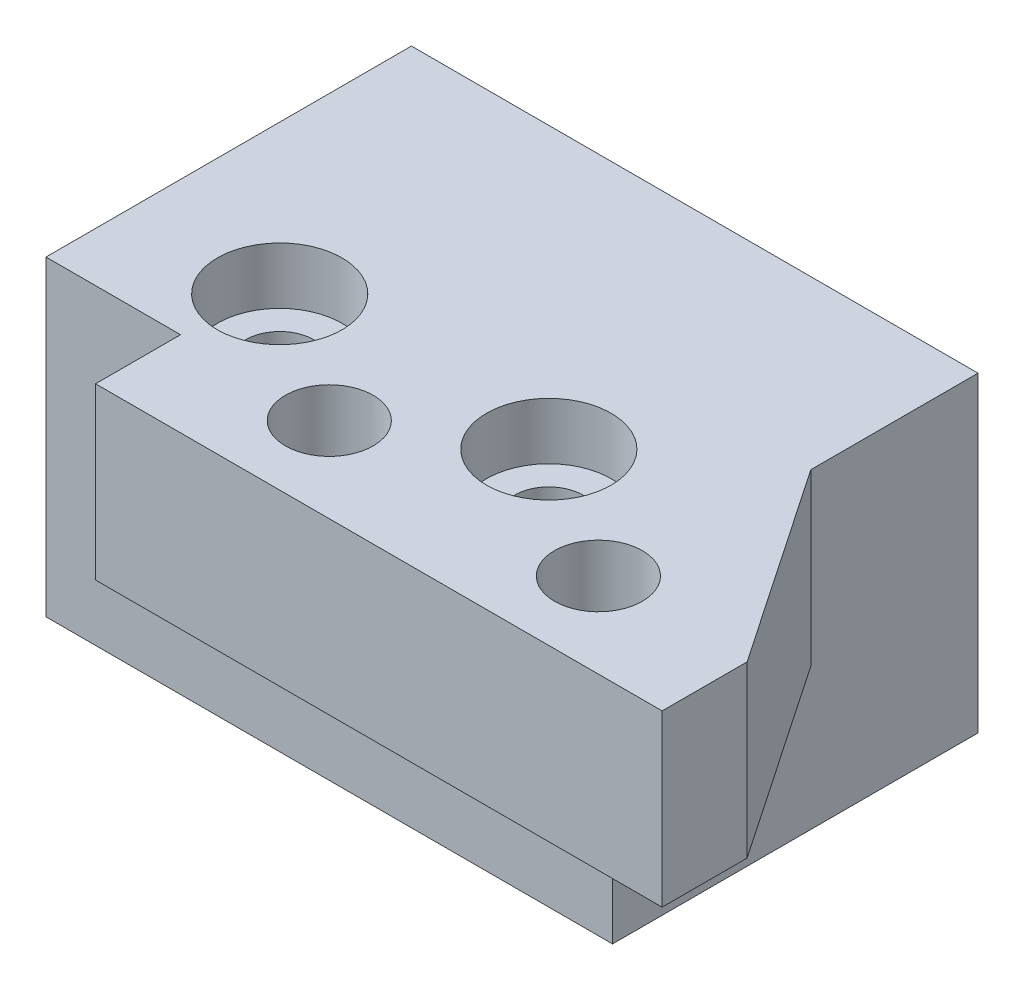
ISO-10303-21;
HEADER;
FILE_DESCRIPTION(('STEP AP214'),'2;1');
FILE_NAME('part.step','',(''),(''),'','','');
FILE_SCHEMA(('AUTOMOTIVE_DESIGN { 1 0 10303 214 1 1 1 1 }'));
ENDSEC;
DATA;
#1=APPLICATION_CONTEXT('core data for automotive mechanical design processes');
#2=APPLICATION_PROTOCOL_DEFINITION('international standard','automotive_design',2000,#1);
#3=PRODUCT_CONTEXT('',#1,'mechanical');
#4=PRODUCT('Part','Part','',(#3));
#5=PRODUCT_RELATED_PRODUCT_CATEGORY('part','',(#4));
#6=PRODUCT_DEFINITION_FORMATION('','',#4);
#7=PRODUCT_DEFINITION_CONTEXT('part definition',#1,'design');
#8=PRODUCT_DEFINITION('design','',#6,#7);
#9=PRODUCT_DEFINITION_SHAPE('','',#8);
#10=(LENGTH_UNIT() NAMED_UNIT(*) SI_UNIT(.MILLI.,.METRE.));
#11=(NAMED_UNIT(*) PLANE_ANGLE_UNIT() SI_UNIT($,.RADIAN.));
#12=(NAMED_UNIT(*) SI_UNIT($,.STERADIAN.) SOLID_ANGLE_UNIT());
#13=UNCERTAINTY_MEASURE_WITH_UNIT(LENGTH_MEASURE(1.E-05),#10,'distance_accuracy_value','');
#14=(GEOMETRIC_REPRESENTATION_CONTEXT(3) GLOBAL_UNCERTAINTY_ASSIGNED_CONTEXT((#13)) GLOBAL_UNIT_ASSIGNED_CONTEXT((#10,
#11,#12)) REPRESENTATION_CONTEXT('',''));
#15=CARTESIAN_POINT('',(0.,0.,0.));
#16=DIRECTION('',(0.,0.,1.));
#17=DIRECTION('',(1.,0.,0.));
#18=AXIS2_PLACEMENT_3D('',#15,#16,#17);
#19=CARTESIAN_POINT('',(0.,11.,0.));
#20=DIRECTION('',(0.,0.,-1.));
#21=DIRECTION('',(-1.,0.,0.));
#22=AXIS2_PLACEMENT_3D('',#19,#20,#21);
#23=PLANE('',#22);
#24=DIRECTION('',(0.,-1.,0.));
#25=VECTOR('',#24,1.);
#26=CARTESIAN_POINT('',(4.75,11.,0.));
#27=LINE('',#26,#25);
#28=CARTESIAN_POINT('',(4.75,11.,0.));
#29=VERTEX_POINT('',#28);
#30=CARTESIAN_POINT('',(4.75,5.,0.));
#31=VERTEX_POINT('',#30);
#32=EDGE_CURVE('E145',#29,#31,#27,.T.);
#33=ORIENTED_EDGE('',*,*,#32,.F.);
#34=DIRECTION('',(1.,0.,0.));
#35=VECTOR('',#34,1.);
#36=CARTESIAN_POINT('',(0.,11.,0.));
#37=LINE('',#36,#35);
#38=CARTESIAN_POINT('',(0.,11.,0.));
#39=VERTEX_POINT('',#38);
#40=EDGE_CURVE('E174',#39,#29,#37,.T.);
#41=ORIENTED_EDGE('',*,*,#40,.F.);
#42=DIRECTION('',(0.,-1.,0.));
#43=VECTOR('',#42,1.);
#44=CARTESIAN_POINT('',(0.,11.,0.));
#45=LINE('',#44,#43);
#46=CARTESIAN_POINT('',(0.,0.,0.));
#47=VERTEX_POINT('',#46);
#48=EDGE_CURVE('E196',#39,#47,#45,.T.);
#49=ORIENTED_EDGE('',*,*,#48,.T.);
#50=DIRECTION('',(1.,0.,0.));
#51=VECTOR('',#50,1.);
#52=CARTESIAN_POINT('',(0.,0.,0.));
#53=LINE('',#52,#51);
#54=CARTESIAN_POINT('',(20.,0.,0.));
#55=VERTEX_POINT('',#54);
#56=EDGE_CURVE('E185',#47,#55,#53,.T.);
#57=ORIENTED_EDGE('',*,*,#56,.T.);
#58=DIRECTION('',(0.,-1.,0.));
#59=VECTOR('',#58,1.);
#60=CARTESIAN_POINT('',(20.,11.,0.));
#61=LINE('',#60,#59);
#62=CARTESIAN_POINT('',(20.,5.,0.));
#63=VERTEX_POINT('',#62);
#64=EDGE_CURVE('E144',#63,#55,#61,.T.);
#65=ORIENTED_EDGE('',*,*,#64,.F.);
#66=DIRECTION('',(1.,0.,0.));
#67=VECTOR('',#66,1.);
#68=CARTESIAN_POINT('',(4.75,5.,0.));
#69=LINE('',#68,#67);
#70=CARTESIAN_POINT('',(17.95,5.,0.));
#71=VERTEX_POINT('',#70);
#72=EDGE_CURVE('E133',#71,#63,#69,.T.);
#73=ORIENTED_EDGE('',*,*,#72,.F.);
#74=CARTESIAN_POINT('',(11.55,5.,0.));
#75=VERTEX_POINT('',#74);
#76=EDGE_CURVE('E142',#75,#71,#69,.T.);
#77=ORIENTED_EDGE('',*,*,#76,.F.);
#78=CARTESIAN_POINT('',(8.45,5.,0.));
#79=VERTEX_POINT('',#78);
#80=EDGE_CURVE('E150',#79,#75,#69,.T.);
#81=ORIENTED_EDGE('',*,*,#80,.F.);
#82=EDGE_CURVE('E147',#31,#79,#69,.T.);
#83=ORIENTED_EDGE('',*,*,#82,.F.);
#84=EDGE_LOOP('',(#33,#41,#49,#57,#65,#73,#77,#81,#83));
#85=FACE_BOUND('',#84,.T.);
#86=ADVANCED_FACE('F41',(#85),#23,.F.);
#87=CARTESIAN_POINT('',(0.,11.,0.));
#88=DIRECTION('',(0.,-1.,0.));
#89=DIRECTION('',(0.,0.,-1.));
#90=AXIS2_PLACEMENT_3D('',#87,#88,#89);
#91=PLANE('',#90);
#92=CARTESIAN_POINT('',(10.,11.,0.));
#93=DIRECTION('',(0.,1.,0.));
#94=DIRECTION('',(0.,0.,1.));
#95=AXIS2_PLACEMENT_3D('',#92,#93,#94);
#96=CIRCLE('',#95,1.55);
#97=CARTESIAN_POINT('',(10.,11.,1.55));
#98=VERTEX_POINT('',#97);
#99=EDGE_CURVE('E255',#98,#98,#96,.T.);
#100=ORIENTED_EDGE('',*,*,#99,.F.);
#101=EDGE_LOOP('',(#100));
#102=FACE_BOUND('',#101,.T.);
#103=CARTESIAN_POINT('',(19.5,11.,0.));
#104=DIRECTION('',(0.,1.,0.));
#105=DIRECTION('',(0.,0.,1.));
#106=AXIS2_PLACEMENT_3D('',#103,#104,#105);
#107=CIRCLE('',#106,1.55);
#108=CARTESIAN_POINT('',(19.5,11.,1.55));
#109=VERTEX_POINT('',#108);
#110=EDGE_CURVE('E136',#109,#109,#107,.T.);
#111=ORIENTED_EDGE('',*,*,#110,.F.);
#112=EDGE_LOOP('',(#111));
#113=FACE_BOUND('',#112,.T.);
#114=CARTESIAN_POINT('',(5.25,11.,-3.));
#115=DIRECTION('',(0.,1.,0.));
#116=DIRECTION('',(0.,0.,1.));
#117=AXIS2_PLACEMENT_3D('',#114,#115,#116);
#118=CIRCLE('',#117,2.19999999999999);
#119=CARTESIAN_POINT('',(5.25,11.,-0.800000000000006));
#120=VERTEX_POINT('',#119);
#121=EDGE_CURVE('E254',#120,#120,#118,.T.);
#122=ORIENTED_EDGE('',*,*,#121,.F.);
#123=EDGE_LOOP('',(#122));
#124=FACE_BOUND('',#123,.T.);
#125=CARTESIAN_POINT('',(14.75,11.,-3.));
#126=DIRECTION('',(0.,1.,0.));
#127=DIRECTION('',(0.,0.,1.));
#128=AXIS2_PLACEMENT_3D('',#125,#126,#127);
#129=CIRCLE('',#128,2.19999999999999);
#130=CARTESIAN_POINT('',(14.75,11.,-0.800000000000006));
#131=VERTEX_POINT('',#130);
#132=EDGE_CURVE('E273',#131,#131,#129,.T.);
#133=ORIENTED_EDGE('',*,*,#132,.F.);
#134=EDGE_LOOP('',(#133));
#135=FACE_BOUND('',#134,.T.);
#136=DIRECTION('',(0.,0.,1.));
#137=VECTOR('',#136,1.);
#138=CARTESIAN_POINT('',(0.,11.,0.));
#139=LINE('',#138,#137);
#140=CARTESIAN_POINT('',(0.,11.,-12.9));
#141=VERTEX_POINT('',#140);
#142=EDGE_CURVE('E171',#141,#39,#139,.T.);
#143=ORIENTED_EDGE('',*,*,#142,.T.);
#144=ORIENTED_EDGE('',*,*,#40,.T.);
#145=DIRECTION('',(0.,0.,-1.));
#146=VECTOR('',#145,1.);
#147=CARTESIAN_POINT('',(4.75,11.,3.));
#148=LINE('',#147,#146);
#149=CARTESIAN_POINT('',(4.75,11.,3.));
#150=VERTEX_POINT('',#149);
#151=EDGE_CURVE('E157',#150,#29,#148,.T.);
#152=ORIENTED_EDGE('',*,*,#151,.F.);
#153=DIRECTION('',(-1.,0.,0.));
#154=VECTOR('',#153,1.);
#155=CARTESIAN_POINT('',(4.75,11.,3.));
#156=LINE('',#155,#154);
#157=CARTESIAN_POINT('',(24.75,11.,3.));
#158=VERTEX_POINT('',#157);
#159=EDGE_CURVE('E161',#158,#150,#156,.T.);
#160=ORIENTED_EDGE('',*,*,#159,.F.);
#161=DIRECTION('',(0.,0.,-1.));
#162=VECTOR('',#161,1.);
#163=CARTESIAN_POINT('',(24.75,11.,3.));
#164=LINE('',#163,#162);
#165=CARTESIAN_POINT('',(24.75,11.,0.));
#166=VERTEX_POINT('',#165);
#167=EDGE_CURVE('E160',#158,#166,#164,.T.);
#168=ORIENTED_EDGE('',*,*,#167,.T.);
#169=DIRECTION('',(0.561501418337266,0.,0.827475774391758));
#170=VECTOR('',#169,1.);
#171=CARTESIAN_POINT('',(16.9467248908297,11.,-11.4995633187773));
#172=LINE('',#171,#170);
#173=CARTESIAN_POINT('',(20.,11.,-6.99999999999996));
#174=VERTEX_POINT('',#173);
#175=EDGE_CURVE('E129',#166,#174,#172,.F.);
#176=ORIENTED_EDGE('',*,*,#175,.T.);
#177=DIRECTION('',(0.,0.,-1.));
#178=VECTOR('',#177,1.);
#179=CARTESIAN_POINT('',(20.,11.,0.));
#180=LINE('',#179,#178);
#181=CARTESIAN_POINT('',(20.,11.,-12.9));
#182=VERTEX_POINT('',#181);
#183=EDGE_CURVE('E178',#174,#182,#180,.T.);
#184=ORIENTED_EDGE('',*,*,#183,.T.);
#185=DIRECTION('',(-1.,0.,0.));
#186=VECTOR('',#185,1.);
#187=CARTESIAN_POINT('',(0.,11.,-12.9));
#188=LINE('',#187,#186);
#189=EDGE_CURVE('E180',#182,#141,#188,.T.);
#190=ORIENTED_EDGE('',*,*,#189,.T.);
#191=EDGE_LOOP('',(#143,#144,#152,#160,#168,#176,#184,#190));
#192=FACE_BOUND('',#191,.T.);
#193=ADVANCED_FACE('F209',(#102,#113,#124,#135,#192),#91,.F.);
#194=CARTESIAN_POINT('',(0.,0.,0.));
#195=DIRECTION('',(0.,-1.,0.));
#196=DIRECTION('',(0.,0.,-1.));
#197=AXIS2_PLACEMENT_3D('',#194,#195,#196);
#198=PLANE('',#197);
#199=CARTESIAN_POINT('',(5.25,0.,-3.));
#200=DIRECTION('',(0.,1.,0.));
#201=DIRECTION('',(0.,0.,1.));
#202=AXIS2_PLACEMENT_3D('',#199,#200,#201);
#203=CIRCLE('',#202,1.2);
#204=CARTESIAN_POINT('',(5.25,0.,-1.8));
#205=VERTEX_POINT('',#204);
#206=EDGE_CURVE('E270',#205,#205,#203,.T.);
#207=ORIENTED_EDGE('',*,*,#206,.T.);
#208=EDGE_LOOP('',(#207));
#209=FACE_BOUND('',#208,.T.);
#210=CARTESIAN_POINT('',(14.75,0.,-3.));
#211=DIRECTION('',(0.,1.,0.));
#212=DIRECTION('',(0.,0.,1.));
#213=AXIS2_PLACEMENT_3D('',#210,#211,#212);
#214=CIRCLE('',#213,1.2);
#215=CARTESIAN_POINT('',(14.75,0.,-1.8));
#216=VERTEX_POINT('',#215);
#217=EDGE_CURVE('E245',#216,#216,#214,.T.);
#218=ORIENTED_EDGE('',*,*,#217,.T.);
#219=EDGE_LOOP('',(#218));
#220=FACE_BOUND('',#219,.T.);
#221=DIRECTION('',(0.,0.,1.));
#222=VECTOR('',#221,1.);
#223=CARTESIAN_POINT('',(0.,0.,0.));
#224=LINE('',#223,#222);
#225=CARTESIAN_POINT('',(0.,0.,-12.9));
#226=VERTEX_POINT('',#225);
#227=EDGE_CURVE('E170',#226,#47,#224,.T.);
#228=ORIENTED_EDGE('',*,*,#227,.F.);
#229=DIRECTION('',(-1.,0.,0.));
#230=VECTOR('',#229,1.);
#231=CARTESIAN_POINT('',(0.,0.,-12.9));
#232=LINE('',#231,#230);
#233=CARTESIAN_POINT('',(20.,0.,-12.9));
#234=VERTEX_POINT('',#233);
#235=EDGE_CURVE('E175',#234,#226,#232,.T.);
#236=ORIENTED_EDGE('',*,*,#235,.F.);
#237=DIRECTION('',(0.,0.,-1.));
#238=VECTOR('',#237,1.);
#239=CARTESIAN_POINT('',(20.,0.,0.));
#240=LINE('',#239,#238);
#241=EDGE_CURVE('E187',#55,#234,#240,.T.);
#242=ORIENTED_EDGE('',*,*,#241,.F.);
#243=ORIENTED_EDGE('',*,*,#56,.F.);
#244=EDGE_LOOP('',(#228,#236,#242,#243));
#245=FACE_BOUND('',#244,.T.);
#246=ADVANCED_FACE('F225',(#209,#220,#245),#198,.T.);
#247=CARTESIAN_POINT('',(0.,11.,0.));
#248=DIRECTION('',(1.,0.,0.));
#249=DIRECTION('',(0.,0.,-1.));
#250=AXIS2_PLACEMENT_3D('',#247,#248,#249);
#251=PLANE('',#250);
#252=ORIENTED_EDGE('',*,*,#227,.T.);
#253=ORIENTED_EDGE('',*,*,#48,.F.);
#254=ORIENTED_EDGE('',*,*,#142,.F.);
#255=DIRECTION('',(0.,-1.,0.));
#256=VECTOR('',#255,1.);
#257=CARTESIAN_POINT('',(0.,11.,-12.9));
#258=LINE('',#257,#256);
#259=EDGE_CURVE('E182',#141,#226,#258,.T.);
#260=ORIENTED_EDGE('',*,*,#259,.T.);
#261=EDGE_LOOP('',(#252,#253,#254,#260));
#262=FACE_BOUND('',#261,.T.);
#263=ADVANCED_FACE('F231',(#262),#251,.F.);
#264=CARTESIAN_POINT('',(20.,11.,0.));
#265=DIRECTION('',(-1.,0.,0.));
#266=DIRECTION('',(0.,0.,1.));
#267=AXIS2_PLACEMENT_3D('',#264,#265,#266);
#268=PLANE('',#267);
#269=ORIENTED_EDGE('',*,*,#183,.F.);
#270=DIRECTION('',(0.,-1.,0.));
#271=VECTOR('',#270,1.);
#272=CARTESIAN_POINT('',(20.,5.,-6.99999999999996));
#273=LINE('',#272,#271);
#274=CARTESIAN_POINT('',(20.,5.,-6.99999999999996));
#275=VERTEX_POINT('',#274);
#276=EDGE_CURVE('E201',#174,#275,#273,.T.);
#277=ORIENTED_EDGE('',*,*,#276,.T.);
#278=DIRECTION('',(0.,0.,1.));
#279=VECTOR('',#278,1.);
#280=CARTESIAN_POINT('',(20.,5.,3.));
#281=LINE('',#280,#279);
#282=CARTESIAN_POINT('',(20.,5.,-1.46714007511212));
#283=VERTEX_POINT('',#282);
#284=EDGE_CURVE('E199',#275,#283,#281,.T.);
#285=ORIENTED_EDGE('',*,*,#284,.T.);
#286=EDGE_CURVE('E135',#283,#63,#281,.T.);
#287=ORIENTED_EDGE('',*,*,#286,.T.);
#288=ORIENTED_EDGE('',*,*,#64,.T.);
#289=ORIENTED_EDGE('',*,*,#241,.T.);
#290=DIRECTION('',(0.,-1.,0.));
#291=VECTOR('',#290,1.);
#292=CARTESIAN_POINT('',(20.,11.,-12.9));
#293=LINE('',#292,#291);
#294=EDGE_CURVE('E192',#182,#234,#293,.T.);
#295=ORIENTED_EDGE('',*,*,#294,.F.);
#296=EDGE_LOOP('',(#269,#277,#285,#287,#288,#289,#295));
#297=FACE_BOUND('',#296,.T.);
#298=ADVANCED_FACE('F217',(#297),#268,.F.);
#299=CARTESIAN_POINT('',(0.,11.,-12.9));
#300=DIRECTION('',(0.,0.,1.));
#301=DIRECTION('',(1.,0.,0.));
#302=AXIS2_PLACEMENT_3D('',#299,#300,#301);
#303=PLANE('',#302);
#304=ORIENTED_EDGE('',*,*,#235,.T.);
#305=ORIENTED_EDGE('',*,*,#259,.F.);
#306=ORIENTED_EDGE('',*,*,#189,.F.);
#307=ORIENTED_EDGE('',*,*,#294,.T.);
#308=EDGE_LOOP('',(#304,#305,#306,#307));
#309=FACE_BOUND('',#308,.T.);
#310=ADVANCED_FACE('F228',(#309),#303,.F.);
#311=CARTESIAN_POINT('',(4.75,11.,3.));
#312=DIRECTION('',(1.,0.,0.));
#313=DIRECTION('',(0.,1.,0.));
#314=AXIS2_PLACEMENT_3D('',#311,#312,#313);
#315=PLANE('',#314);
#316=ORIENTED_EDGE('',*,*,#32,.T.);
#317=DIRECTION('',(0.,0.,-1.));
#318=VECTOR('',#317,1.);
#319=CARTESIAN_POINT('',(4.75,5.,3.));
#320=LINE('',#319,#318);
#321=CARTESIAN_POINT('',(4.75,5.,3.));
#322=VERTEX_POINT('',#321);
#323=EDGE_CURVE('E167',#322,#31,#320,.T.);
#324=ORIENTED_EDGE('',*,*,#323,.F.);
#325=DIRECTION('',(0.,-1.,0.));
#326=VECTOR('',#325,1.);
#327=CARTESIAN_POINT('',(4.75,11.,3.));
#328=LINE('',#327,#326);
#329=EDGE_CURVE('E156',#150,#322,#328,.T.);
#330=ORIENTED_EDGE('',*,*,#329,.F.);
#331=ORIENTED_EDGE('',*,*,#151,.T.);
#332=EDGE_LOOP('',(#316,#324,#330,#331));
#333=FACE_BOUND('',#332,.T.);
#334=ADVANCED_FACE('F236',(#333),#315,.F.);
#335=CARTESIAN_POINT('',(4.75,5.,3.));
#336=DIRECTION('',(0.,1.,0.));
#337=DIRECTION('',(0.,0.,1.));
#338=AXIS2_PLACEMENT_3D('',#335,#336,#337);
#339=PLANE('',#338);
#340=ORIENTED_EDGE('',*,*,#82,.T.);
#341=CARTESIAN_POINT('',(10.,5.,0.));
#342=DIRECTION('',(0.,1.,0.));
#343=DIRECTION('',(0.,0.,1.));
#344=AXIS2_PLACEMENT_3D('',#341,#342,#343);
#345=CIRCLE('',#344,1.55);
#346=EDGE_CURVE('E11',#79,#75,#345,.T.);
#347=ORIENTED_EDGE('',*,*,#346,.T.);
#348=ORIENTED_EDGE('',*,*,#76,.T.);
#349=CARTESIAN_POINT('',(19.5,5.,0.));
#350=DIRECTION('',(0.,1.,0.));
#351=DIRECTION('',(0.,0.,1.));
#352=AXIS2_PLACEMENT_3D('',#349,#350,#351);
#353=CIRCLE('',#352,1.55);
#354=EDGE_CURVE('E50',#71,#283,#353,.T.);
#355=ORIENTED_EDGE('',*,*,#354,.T.);
#356=ORIENTED_EDGE('',*,*,#284,.F.);
#357=DIRECTION('',(-0.561501418337266,0.,-0.827475774391758));
#358=VECTOR('',#357,1.);
#359=CARTESIAN_POINT('',(19.8382096069869,5.,-7.23842794759826));
#360=LINE('',#359,#358);
#361=CARTESIAN_POINT('',(24.75,5.,0.));
#362=VERTEX_POINT('',#361);
#363=EDGE_CURVE('E204',#275,#362,#360,.F.);
#364=ORIENTED_EDGE('',*,*,#363,.T.);
#365=DIRECTION('',(0.,0.,-1.));
#366=VECTOR('',#365,1.);
#367=CARTESIAN_POINT('',(24.75,5.,3.));
#368=LINE('',#367,#366);
#369=CARTESIAN_POINT('',(24.75,5.,3.));
#370=VERTEX_POINT('',#369);
#371=EDGE_CURVE('E164',#370,#362,#368,.T.);
#372=ORIENTED_EDGE('',*,*,#371,.F.);
#373=DIRECTION('',(1.,0.,0.));
#374=VECTOR('',#373,1.);
#375=CARTESIAN_POINT('',(4.75,5.,3.));
#376=LINE('',#375,#374);
#377=EDGE_CURVE('E240',#322,#370,#376,.T.);
#378=ORIENTED_EDGE('',*,*,#377,.F.);
#379=ORIENTED_EDGE('',*,*,#323,.T.);
#380=EDGE_LOOP('',(#340,#347,#348,#355,#356,#364,#372,#378,#379));
#381=FACE_BOUND('',#380,.T.);
#382=ADVANCED_FACE('F149',(#381),#339,.F.);
#383=CARTESIAN_POINT('',(24.75,11.,3.));
#384=DIRECTION('',(-1.,0.,0.));
#385=DIRECTION('',(0.,0.,1.));
#386=AXIS2_PLACEMENT_3D('',#383,#384,#385);
#387=PLANE('',#386);
#388=DIRECTION('',(0.,1.,0.));
#389=VECTOR('',#388,1.);
#390=CARTESIAN_POINT('',(24.75,11.,0.));
#391=LINE('',#390,#389);
#392=EDGE_CURVE('E153',#362,#166,#391,.T.);
#393=ORIENTED_EDGE('',*,*,#392,.T.);
#394=ORIENTED_EDGE('',*,*,#167,.F.);
#395=DIRECTION('',(0.,1.,0.));
#396=VECTOR('',#395,1.);
#397=CARTESIAN_POINT('',(24.75,11.,3.));
#398=LINE('',#397,#396);
#399=EDGE_CURVE('E242',#370,#158,#398,.T.);
#400=ORIENTED_EDGE('',*,*,#399,.F.);
#401=ORIENTED_EDGE('',*,*,#371,.T.);
#402=EDGE_LOOP('',(#393,#394,#400,#401));
#403=FACE_BOUND('',#402,.T.);
#404=ADVANCED_FACE('F251',(#403),#387,.F.);
#405=CARTESIAN_POINT('',(0.,0.,3.));
#406=DIRECTION('',(0.,0.,1.));
#407=DIRECTION('',(1.,0.,0.));
#408=AXIS2_PLACEMENT_3D('',#405,#406,#407);
#409=PLANE('',#408);
#410=ORIENTED_EDGE('',*,*,#329,.T.);
#411=ORIENTED_EDGE('',*,*,#377,.T.);
#412=ORIENTED_EDGE('',*,*,#399,.T.);
#413=ORIENTED_EDGE('',*,*,#159,.T.);
#414=EDGE_LOOP('',(#410,#411,#412,#413));
#415=FACE_BOUND('',#414,.T.);
#416=ADVANCED_FACE('F248',(#415),#409,.T.);
#417=CARTESIAN_POINT('',(14.75,11.,-3.));
#418=DIRECTION('',(0.,1.,0.));
#419=DIRECTION('',(0.,0.,1.));
#420=AXIS2_PLACEMENT_3D('',#417,#418,#419);
#421=CYLINDRICAL_SURFACE('',#420,1.2);
#422=ORIENTED_EDGE('',*,*,#217,.F.);
#423=EDGE_LOOP('',(#422));
#424=FACE_BOUND('',#423,.T.);
#425=CARTESIAN_POINT('',(14.75,9.,-3.));
#426=DIRECTION('',(0.,1.,0.));
#427=DIRECTION('',(0.,0.,1.));
#428=AXIS2_PLACEMENT_3D('',#425,#426,#427);
#429=CIRCLE('',#428,1.2);
#430=CARTESIAN_POINT('',(14.75,9.,-1.8));
#431=VERTEX_POINT('',#430);
#432=EDGE_CURVE('E278',#431,#431,#429,.T.);
#433=ORIENTED_EDGE('',*,*,#432,.T.);
#434=EDGE_LOOP('',(#433));
#435=FACE_BOUND('',#434,.T.);
#436=ADVANCED_FACE('F286',(#424,#435),#421,.F.);
#437=CARTESIAN_POINT('',(15.95,9.,-3.));
#438=DIRECTION('',(0.,-1.,0.));
#439=DIRECTION('',(0.,0.,-1.));
#440=AXIS2_PLACEMENT_3D('',#437,#438,#439);
#441=PLANE('',#440);
#442=ORIENTED_EDGE('',*,*,#432,.F.);
#443=EDGE_LOOP('',(#442));
#444=FACE_BOUND('',#443,.T.);
#445=CARTESIAN_POINT('',(14.75,9.,-3.));
#446=DIRECTION('',(0.,1.,0.));
#447=DIRECTION('',(0.,0.,1.));
#448=AXIS2_PLACEMENT_3D('',#445,#446,#447);
#449=CIRCLE('',#448,2.2);
#450=CARTESIAN_POINT('',(14.75,9.,-0.800000000000003));
#451=VERTEX_POINT('',#450);
#452=EDGE_CURVE('E276',#451,#451,#449,.T.);
#453=ORIENTED_EDGE('',*,*,#452,.T.);
#454=EDGE_LOOP('',(#453));
#455=FACE_BOUND('',#454,.T.);
#456=ADVANCED_FACE('F288',(#444,#455),#441,.F.);
#457=CARTESIAN_POINT('',(14.75,11.,-3.));
#458=DIRECTION('',(0.,1.,0.));
#459=DIRECTION('',(0.,0.,1.));
#460=AXIS2_PLACEMENT_3D('',#457,#458,#459);
#461=CYLINDRICAL_SURFACE('',#460,2.2);
#462=ORIENTED_EDGE('',*,*,#452,.F.);
#463=EDGE_LOOP('',(#462));
#464=FACE_BOUND('',#463,.T.);
#465=ORIENTED_EDGE('',*,*,#132,.T.);
#466=EDGE_LOOP('',(#465));
#467=FACE_BOUND('',#466,.T.);
#468=ADVANCED_FACE('F294',(#464,#467),#461,.F.);
#469=CARTESIAN_POINT('',(5.25,11.,-3.));
#470=DIRECTION('',(0.,1.,0.));
#471=DIRECTION('',(0.,0.,1.));
#472=AXIS2_PLACEMENT_3D('',#469,#470,#471);
#473=CYLINDRICAL_SURFACE('',#472,1.2);
#474=ORIENTED_EDGE('',*,*,#206,.F.);
#475=EDGE_LOOP('',(#474));
#476=FACE_BOUND('',#475,.T.);
#477=CARTESIAN_POINT('',(5.25,9.,-3.));
#478=DIRECTION('',(0.,1.,0.));
#479=DIRECTION('',(0.,0.,1.));
#480=AXIS2_PLACEMENT_3D('',#477,#478,#479);
#481=CIRCLE('',#480,1.2);
#482=CARTESIAN_POINT('',(5.25,9.,-1.8));
#483=VERTEX_POINT('',#482);
#484=EDGE_CURVE('E267',#483,#483,#481,.T.);
#485=ORIENTED_EDGE('',*,*,#484,.T.);
#486=EDGE_LOOP('',(#485));
#487=FACE_BOUND('',#486,.T.);
#488=ADVANCED_FACE('F389',(#476,#487),#473,.F.);
#489=CARTESIAN_POINT('',(6.45,9.,-3.));
#490=DIRECTION('',(0.,-1.,0.));
#491=DIRECTION('',(0.,0.,-1.));
#492=AXIS2_PLACEMENT_3D('',#489,#490,#491);
#493=PLANE('',#492);
#494=ORIENTED_EDGE('',*,*,#484,.F.);
#495=EDGE_LOOP('',(#494));
#496=FACE_BOUND('',#495,.T.);
#497=CARTESIAN_POINT('',(5.25,9.,-3.));
#498=DIRECTION('',(0.,1.,0.));
#499=DIRECTION('',(0.,0.,1.));
#500=AXIS2_PLACEMENT_3D('',#497,#498,#499);
#501=CIRCLE('',#500,2.2);
#502=CARTESIAN_POINT('',(5.25,9.,-0.800000000000004));
#503=VERTEX_POINT('',#502);
#504=EDGE_CURVE('E258',#503,#503,#501,.T.);
#505=ORIENTED_EDGE('',*,*,#504,.T.);
#506=EDGE_LOOP('',(#505));
#507=FACE_BOUND('',#506,.T.);
#508=ADVANCED_FACE('F386',(#496,#507),#493,.F.);
#509=CARTESIAN_POINT('',(5.25,11.,-3.));
#510=DIRECTION('',(0.,1.,0.));
#511=DIRECTION('',(0.,0.,1.));
#512=AXIS2_PLACEMENT_3D('',#509,#510,#511);
#513=CYLINDRICAL_SURFACE('',#512,2.19999999999999);
#514=ORIENTED_EDGE('',*,*,#504,.F.);
#515=EDGE_LOOP('',(#514));
#516=FACE_BOUND('',#515,.T.);
#517=ORIENTED_EDGE('',*,*,#121,.T.);
#518=EDGE_LOOP('',(#517));
#519=FACE_BOUND('',#518,.T.);
#520=ADVANCED_FACE('F336',(#516,#519),#513,.F.);
#521=CARTESIAN_POINT('',(20.,11.,-6.99999999999996));
#522=DIRECTION('',(0.827475774391758,0.,-0.561501418337266));
#523=DIRECTION('',(0.,1.,0.));
#524=AXIS2_PLACEMENT_3D('',#521,#522,#523);
#525=PLANE('',#524);
#526=ORIENTED_EDGE('',*,*,#175,.F.);
#527=ORIENTED_EDGE('',*,*,#392,.F.);
#528=ORIENTED_EDGE('',*,*,#363,.F.);
#529=ORIENTED_EDGE('',*,*,#276,.F.);
#530=EDGE_LOOP('',(#526,#527,#528,#529));
#531=FACE_BOUND('',#530,.T.);
#532=ADVANCED_FACE('F44',(#531),#525,.T.);
#533=CARTESIAN_POINT('',(19.5,5.,0.));
#534=DIRECTION('',(0.,1.,0.));
#535=DIRECTION('',(0.,0.,1.));
#536=AXIS2_PLACEMENT_3D('',#533,#534,#535);
#537=PLANE('',#536);
#538=ORIENTED_EDGE('',*,*,#72,.T.);
#539=ORIENTED_EDGE('',*,*,#286,.F.);
#540=CARTESIAN_POINT('',(19.5,5.,0.));
#541=DIRECTION('',(0.,1.,0.));
#542=DIRECTION('',(0.,0.,1.));
#543=AXIS2_PLACEMENT_3D('',#540,#541,#542);
#544=CIRCLE('',#543,1.55);
#545=EDGE_CURVE('E56',#283,#71,#544,.T.);
#546=ORIENTED_EDGE('',*,*,#545,.T.);
#547=EDGE_LOOP('',(#538,#539,#546));
#548=FACE_BOUND('',#547,.T.);
#549=ADVANCED_FACE('F132',(#548),#537,.T.);
#550=CARTESIAN_POINT('',(19.5,5.,0.));
#551=DIRECTION('',(0.,1.,0.));
#552=DIRECTION('',(0.,0.,1.));
#553=AXIS2_PLACEMENT_3D('',#550,#551,#552);
#554=CYLINDRICAL_SURFACE('',#553,1.55);
#555=ORIENTED_EDGE('',*,*,#545,.F.);
#556=ORIENTED_EDGE('',*,*,#354,.F.);
#557=EDGE_LOOP('',(#555,#556));
#558=FACE_BOUND('',#557,.T.);
#559=ORIENTED_EDGE('',*,*,#110,.T.);
#560=EDGE_LOOP('',(#559));
#561=FACE_BOUND('',#560,.T.);
#562=ADVANCED_FACE('F123',(#558,#561),#554,.F.);
#563=CARTESIAN_POINT('',(10.,5.,0.));
#564=DIRECTION('',(0.,1.,0.));
#565=DIRECTION('',(0.,0.,1.));
#566=AXIS2_PLACEMENT_3D('',#563,#564,#565);
#567=PLANE('',#566);
#568=ORIENTED_EDGE('',*,*,#80,.T.);
#569=CARTESIAN_POINT('',(10.,5.,0.));
#570=DIRECTION('',(0.,1.,0.));
#571=DIRECTION('',(0.,0.,1.));
#572=AXIS2_PLACEMENT_3D('',#569,#570,#571);
#573=CIRCLE('',#572,1.55);
#574=EDGE_CURVE('E63',#75,#79,#573,.T.);
#575=ORIENTED_EDGE('',*,*,#574,.T.);
#576=EDGE_LOOP('',(#568,#575));
#577=FACE_BOUND('',#576,.T.);
#578=ADVANCED_FACE('F253',(#577),#567,.T.);
#579=CARTESIAN_POINT('',(10.,5.,0.));
#580=DIRECTION('',(0.,1.,0.));
#581=DIRECTION('',(0.,0.,1.));
#582=AXIS2_PLACEMENT_3D('',#579,#580,#581);
#583=CYLINDRICAL_SURFACE('',#582,1.55);
#584=ORIENTED_EDGE('',*,*,#574,.F.);
#585=ORIENTED_EDGE('',*,*,#346,.F.);
#586=EDGE_LOOP('',(#584,#585));
#587=FACE_BOUND('',#586,.T.);
#588=ORIENTED_EDGE('',*,*,#99,.T.);
#589=EDGE_LOOP('',(#588));
#590=FACE_BOUND('',#589,.T.);
#591=ADVANCED_FACE('F372',(#587,#590),#583,.F.);
#592=CLOSED_SHELL('',(#86,#193,#246,#263,#298,#310,#334,#382,#404,#416,#436,#456,#468,#488,#508,
#520,#532,#549,#562,#578,#591));
#593=MANIFOLD_SOLID_BREP('B2',#592);
#594=ADVANCED_BREP_SHAPE_REPRESENTATION('',(#18,#593),#14);
#595=SHAPE_DEFINITION_REPRESENTATION(#9,#594);
ENDSEC;
END-ISO-10303-21;
